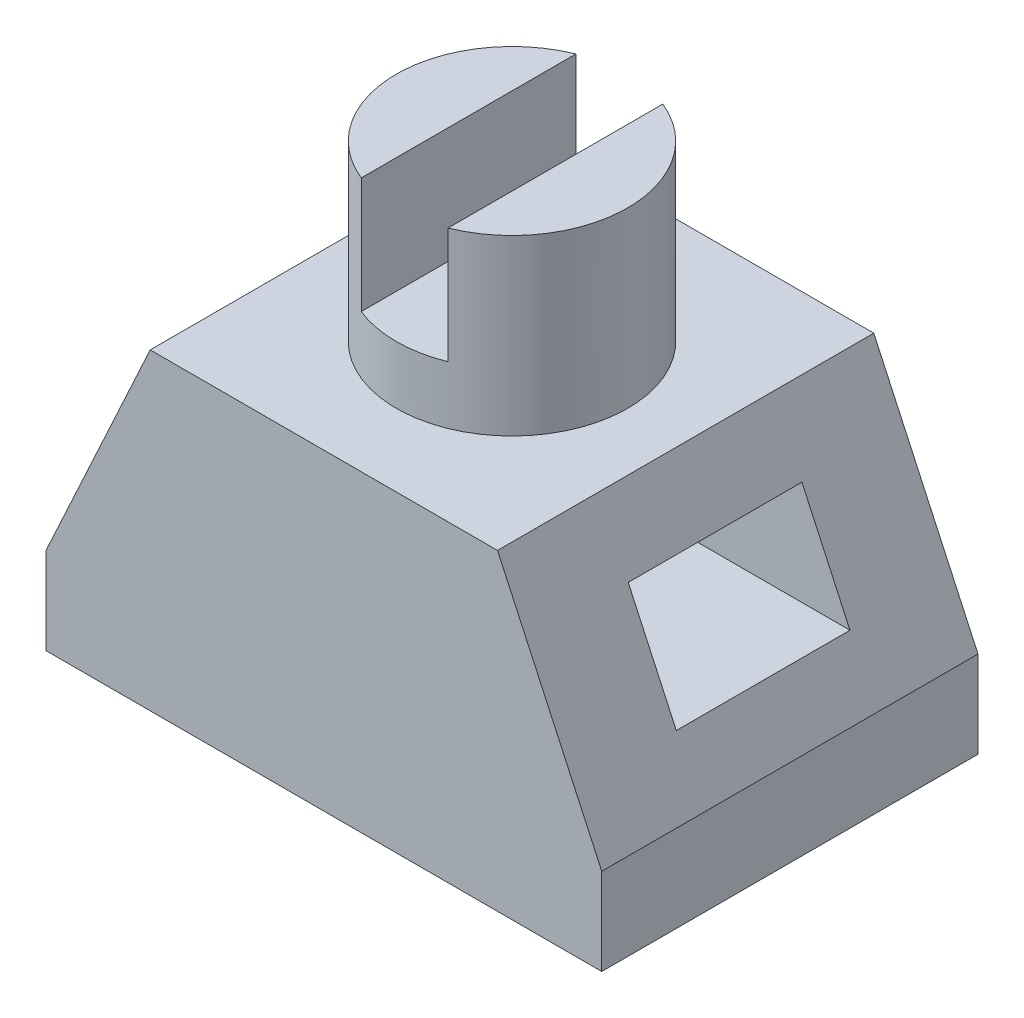
ISO-10303-21;
HEADER;
FILE_DESCRIPTION(('STEP AP214'),'2;1');
FILE_NAME('part.step','',(''),(''),'','','');
FILE_SCHEMA(('AUTOMOTIVE_DESIGN { 1 0 10303 214 1 1 1 1 }'));
ENDSEC;
DATA;
#1=APPLICATION_CONTEXT('core data for automotive mechanical design processes');
#2=APPLICATION_PROTOCOL_DEFINITION('international standard','automotive_design',2000,#1);
#3=PRODUCT_CONTEXT('',#1,'mechanical');
#4=PRODUCT('Part','Part','',(#3));
#5=PRODUCT_RELATED_PRODUCT_CATEGORY('part','',(#4));
#6=PRODUCT_DEFINITION_FORMATION('','',#4);
#7=PRODUCT_DEFINITION_CONTEXT('part definition',#1,'design');
#8=PRODUCT_DEFINITION('design','',#6,#7);
#9=PRODUCT_DEFINITION_SHAPE('','',#8);
#10=(LENGTH_UNIT() NAMED_UNIT(*) SI_UNIT(.MILLI.,.METRE.));
#11=(NAMED_UNIT(*) PLANE_ANGLE_UNIT() SI_UNIT($,.RADIAN.));
#12=(NAMED_UNIT(*) SI_UNIT($,.STERADIAN.) SOLID_ANGLE_UNIT());
#13=UNCERTAINTY_MEASURE_WITH_UNIT(LENGTH_MEASURE(1.E-05),#10,'distance_accuracy_value','');
#14=(GEOMETRIC_REPRESENTATION_CONTEXT(3) GLOBAL_UNCERTAINTY_ASSIGNED_CONTEXT((#13)) GLOBAL_UNIT_ASSIGNED_CONTEXT((#10,
#11,#12)) REPRESENTATION_CONTEXT('',''));
#15=CARTESIAN_POINT('',(0.,0.,0.));
#16=DIRECTION('',(0.,0.,1.));
#17=DIRECTION('',(1.,0.,0.));
#18=AXIS2_PLACEMENT_3D('',#15,#16,#17);
#19=CARTESIAN_POINT('',(0.,57.,0.));
#20=DIRECTION('',(0.,1.,0.));
#21=DIRECTION('',(0.,0.,1.));
#22=AXIS2_PLACEMENT_3D('',#19,#20,#21);
#23=PLANE('',#22);
#24=DIRECTION('',(0.,0.,-1.));
#25=VECTOR('',#24,1.);
#26=CARTESIAN_POINT('',(7.5,57.,0.));
#27=LINE('',#26,#25);
#28=CARTESIAN_POINT('',(7.5,57.,18.5404962177392));
#29=VERTEX_POINT('',#28);
#30=CARTESIAN_POINT('',(7.5,57.,-18.5404962177392));
#31=VERTEX_POINT('',#30);
#32=EDGE_CURVE('E142',#29,#31,#27,.T.);
#33=ORIENTED_EDGE('',*,*,#32,.F.);
#34=CARTESIAN_POINT('',(0.,57.,0.));
#35=DIRECTION('',(0.,1.,0.));
#36=DIRECTION('',(0.,0.,1.));
#37=AXIS2_PLACEMENT_3D('',#34,#35,#36);
#38=CIRCLE('',#37,20.);
#39=EDGE_CURVE('E154',#29,#31,#38,.T.);
#40=ORIENTED_EDGE('',*,*,#39,.T.);
#41=EDGE_LOOP('',(#33,#40));
#42=FACE_BOUND('',#41,.T.);
#43=ADVANCED_FACE('F35',(#42),#23,.T.);
#44=CARTESIAN_POINT('',(30.,27.,32.5));
#45=DIRECTION('',(0.,-1.,0.));
#46=DIRECTION('',(0.,0.,-1.));
#47=AXIS2_PLACEMENT_3D('',#44,#45,#46);
#48=PLANE('',#47);
#49=DIRECTION('',(-1.,0.,0.));
#50=VECTOR('',#49,1.);
#51=CARTESIAN_POINT('',(30.,27.,-32.5));
#52=LINE('',#51,#50);
#53=CARTESIAN_POINT('',(30.,27.,-32.5));
#54=VERTEX_POINT('',#53);
#55=CARTESIAN_POINT('',(-30.,27.,-32.5));
#56=VERTEX_POINT('',#55);
#57=EDGE_CURVE('E208',#54,#56,#52,.T.);
#58=ORIENTED_EDGE('',*,*,#57,.T.);
#59=DIRECTION('',(0.,0.,-1.));
#60=VECTOR('',#59,1.);
#61=CARTESIAN_POINT('',(-30.,27.,32.5));
#62=LINE('',#61,#60);
#63=CARTESIAN_POINT('',(-30.,27.,32.5));
#64=VERTEX_POINT('',#63);
#65=EDGE_CURVE('E213',#64,#56,#62,.T.);
#66=ORIENTED_EDGE('',*,*,#65,.F.);
#67=DIRECTION('',(-1.,0.,0.));
#68=VECTOR('',#67,1.);
#69=CARTESIAN_POINT('',(30.,27.,32.5));
#70=LINE('',#69,#68);
#71=CARTESIAN_POINT('',(30.,27.,32.5));
#72=VERTEX_POINT('',#71);
#73=EDGE_CURVE('E195',#72,#64,#70,.T.);
#74=ORIENTED_EDGE('',*,*,#73,.F.);
#75=DIRECTION('',(0.,0.,-1.));
#76=VECTOR('',#75,1.);
#77=CARTESIAN_POINT('',(30.,27.,32.5));
#78=LINE('',#77,#76);
#79=EDGE_CURVE('E216',#72,#54,#78,.T.);
#80=ORIENTED_EDGE('',*,*,#79,.T.);
#81=EDGE_LOOP('',(#58,#66,#74,#80));
#82=FACE_BOUND('',#81,.T.);
#83=CARTESIAN_POINT('',(0.,27.,0.));
#84=DIRECTION('',(0.,-1.,0.));
#85=DIRECTION('',(0.,0.,-1.));
#86=AXIS2_PLACEMENT_3D('',#83,#84,#85);
#87=CIRCLE('',#86,20.);
#88=CARTESIAN_POINT('',(0.,27.,-20.));
#89=VERTEX_POINT('',#88);
#90=EDGE_CURVE('E143',#89,#89,#87,.F.);
#91=ORIENTED_EDGE('',*,*,#90,.F.);
#92=EDGE_LOOP('',(#91));
#93=FACE_BOUND('',#92,.T.);
#94=ADVANCED_FACE('F256',(#82,#93),#48,.F.);
#95=CARTESIAN_POINT('',(-48.,-12.,32.5));
#96=DIRECTION('',(1.,0.,0.));
#97=DIRECTION('',(0.,0.,-1.));
#98=AXIS2_PLACEMENT_3D('',#95,#96,#97);
#99=PLANE('',#98);
#100=DIRECTION('',(0.,-1.,0.));
#101=VECTOR('',#100,1.);
#102=CARTESIAN_POINT('',(-48.,-12.,-32.5));
#103=LINE('',#102,#101);
#104=CARTESIAN_POINT('',(-48.,-12.,-32.5));
#105=VERTEX_POINT('',#104);
#106=CARTESIAN_POINT('',(-48.,-27.,-32.5));
#107=VERTEX_POINT('',#106);
#108=EDGE_CURVE('E184',#105,#107,#103,.T.);
#109=ORIENTED_EDGE('',*,*,#108,.T.);
#110=DIRECTION('',(0.,0.,-1.));
#111=VECTOR('',#110,1.);
#112=CARTESIAN_POINT('',(-48.,-27.,32.5));
#113=LINE('',#112,#111);
#114=CARTESIAN_POINT('',(-48.,-27.,32.5));
#115=VERTEX_POINT('',#114);
#116=EDGE_CURVE('E225',#115,#107,#113,.T.);
#117=ORIENTED_EDGE('',*,*,#116,.F.);
#118=DIRECTION('',(0.,-1.,0.));
#119=VECTOR('',#118,1.);
#120=CARTESIAN_POINT('',(-48.,-12.,32.5));
#121=LINE('',#120,#119);
#122=CARTESIAN_POINT('',(-48.,-12.,32.5));
#123=VERTEX_POINT('',#122);
#124=EDGE_CURVE('E185',#123,#115,#121,.T.);
#125=ORIENTED_EDGE('',*,*,#124,.F.);
#126=DIRECTION('',(0.,0.,-1.));
#127=VECTOR('',#126,1.);
#128=CARTESIAN_POINT('',(-48.,-12.,32.5));
#129=LINE('',#128,#127);
#130=EDGE_CURVE('E199',#123,#105,#129,.T.);
#131=ORIENTED_EDGE('',*,*,#130,.T.);
#132=EDGE_LOOP('',(#109,#117,#125,#131));
#133=FACE_BOUND('',#132,.T.);
#134=ADVANCED_FACE('F37',(#133),#99,.F.);
#135=CARTESIAN_POINT('',(-48.,-27.,32.5));
#136=DIRECTION('',(0.,1.,0.));
#137=DIRECTION('',(0.,0.,1.));
#138=AXIS2_PLACEMENT_3D('',#135,#136,#137);
#139=PLANE('',#138);
#140=DIRECTION('',(1.,0.,0.));
#141=VECTOR('',#140,1.);
#142=CARTESIAN_POINT('',(-48.,-27.,-32.5));
#143=LINE('',#142,#141);
#144=CARTESIAN_POINT('',(48.,-27.,-32.5));
#145=VERTEX_POINT('',#144);
#146=EDGE_CURVE('E202',#107,#145,#143,.T.);
#147=ORIENTED_EDGE('',*,*,#146,.T.);
#148=DIRECTION('',(0.,0.,-1.));
#149=VECTOR('',#148,1.);
#150=CARTESIAN_POINT('',(48.,-27.,32.5));
#151=LINE('',#150,#149);
#152=CARTESIAN_POINT('',(48.,-27.,32.5));
#153=VERTEX_POINT('',#152);
#154=EDGE_CURVE('E222',#153,#145,#151,.T.);
#155=ORIENTED_EDGE('',*,*,#154,.F.);
#156=DIRECTION('',(1.,0.,0.));
#157=VECTOR('',#156,1.);
#158=CARTESIAN_POINT('',(-48.,-27.,32.5));
#159=LINE('',#158,#157);
#160=EDGE_CURVE('E188',#115,#153,#159,.T.);
#161=ORIENTED_EDGE('',*,*,#160,.F.);
#162=ORIENTED_EDGE('',*,*,#116,.T.);
#163=EDGE_LOOP('',(#147,#155,#161,#162));
#164=FACE_BOUND('',#163,.T.);
#165=ADVANCED_FACE('F307',(#164),#139,.F.);
#166=CARTESIAN_POINT('',(48.,-12.,32.5));
#167=DIRECTION('',(-1.,0.,0.));
#168=DIRECTION('',(0.,0.,1.));
#169=AXIS2_PLACEMENT_3D('',#166,#167,#168);
#170=PLANE('',#169);
#171=DIRECTION('',(0.,1.,0.));
#172=VECTOR('',#171,1.);
#173=CARTESIAN_POINT('',(48.,-12.,-32.5));
#174=LINE('',#173,#172);
#175=CARTESIAN_POINT('',(48.,-12.,-32.5));
#176=VERTEX_POINT('',#175);
#177=EDGE_CURVE('E204',#145,#176,#174,.T.);
#178=ORIENTED_EDGE('',*,*,#177,.T.);
#179=DIRECTION('',(0.,0.,-1.));
#180=VECTOR('',#179,1.);
#181=CARTESIAN_POINT('',(48.,-12.,32.5));
#182=LINE('',#181,#180);
#183=CARTESIAN_POINT('',(48.,-12.,32.5));
#184=VERTEX_POINT('',#183);
#185=EDGE_CURVE('E219',#184,#176,#182,.T.);
#186=ORIENTED_EDGE('',*,*,#185,.F.);
#187=DIRECTION('',(0.,1.,0.));
#188=VECTOR('',#187,1.);
#189=CARTESIAN_POINT('',(48.,-12.,32.5));
#190=LINE('',#189,#188);
#191=EDGE_CURVE('E191',#153,#184,#190,.T.);
#192=ORIENTED_EDGE('',*,*,#191,.F.);
#193=ORIENTED_EDGE('',*,*,#154,.T.);
#194=EDGE_LOOP('',(#178,#186,#192,#193));
#195=FACE_BOUND('',#194,.T.);
#196=ADVANCED_FACE('F304',(#195),#170,.F.);
#197=CARTESIAN_POINT('',(30.,27.,32.5));
#198=DIRECTION('',(-0.907959384500451,-0.419058177461748,0.));
#199=DIRECTION('',(0.419058177461748,-0.907959384500451,0.));
#200=AXIS2_PLACEMENT_3D('',#197,#198,#199);
#201=PLANE('',#200);
#202=DIRECTION('',(0.,0.,-1.));
#203=VECTOR('',#202,1.);
#204=CARTESIAN_POINT('',(35.0769230769231,16.,32.5));
#205=LINE('',#204,#203);
#206=CARTESIAN_POINT('',(35.0769230769231,16.,15.));
#207=VERTEX_POINT('',#206);
#208=CARTESIAN_POINT('',(35.0769230769231,16.,-15.));
#209=VERTEX_POINT('',#208);
#210=EDGE_CURVE('E165',#207,#209,#205,.T.);
#211=ORIENTED_EDGE('',*,*,#210,.T.);
#212=DIRECTION('',(0.419058177461748,-0.907959384500451,0.));
#213=VECTOR('',#212,1.);
#214=CARTESIAN_POINT('',(30.,27.,-15.));
#215=LINE('',#214,#213);
#216=CARTESIAN_POINT('',(43.3846153846154,-2.,-15.));
#217=VERTEX_POINT('',#216);
#218=EDGE_CURVE('E181',#209,#217,#215,.T.);
#219=ORIENTED_EDGE('',*,*,#218,.T.);
#220=DIRECTION('',(0.,0.,1.));
#221=VECTOR('',#220,1.);
#222=CARTESIAN_POINT('',(43.3846153846154,-2.,32.5));
#223=LINE('',#222,#221);
#224=CARTESIAN_POINT('',(43.3846153846154,-2.,15.));
#225=VERTEX_POINT('',#224);
#226=EDGE_CURVE('E178',#217,#225,#223,.T.);
#227=ORIENTED_EDGE('',*,*,#226,.T.);
#228=DIRECTION('',(-0.419058177461748,0.907959384500451,0.));
#229=VECTOR('',#228,1.);
#230=CARTESIAN_POINT('',(30.,27.,15.));
#231=LINE('',#230,#229);
#232=EDGE_CURVE('E175',#225,#207,#231,.T.);
#233=ORIENTED_EDGE('',*,*,#232,.T.);
#234=EDGE_LOOP('',(#211,#219,#227,#233));
#235=FACE_BOUND('',#234,.T.);
#236=DIRECTION('',(-0.419058177461748,0.907959384500451,0.));
#237=VECTOR('',#236,1.);
#238=CARTESIAN_POINT('',(30.,27.,-32.5));
#239=LINE('',#238,#237);
#240=EDGE_CURVE('E206',#176,#54,#239,.T.);
#241=ORIENTED_EDGE('',*,*,#240,.T.);
#242=ORIENTED_EDGE('',*,*,#79,.F.);
#243=DIRECTION('',(-0.419058177461748,0.907959384500451,0.));
#244=VECTOR('',#243,1.);
#245=CARTESIAN_POINT('',(30.,27.,32.5));
#246=LINE('',#245,#244);
#247=EDGE_CURVE('E193',#184,#72,#246,.T.);
#248=ORIENTED_EDGE('',*,*,#247,.F.);
#249=ORIENTED_EDGE('',*,*,#185,.T.);
#250=EDGE_LOOP('',(#241,#242,#248,#249));
#251=FACE_BOUND('',#250,.T.);
#252=ADVANCED_FACE('F299',(#235,#251),#201,.F.);
#253=CARTESIAN_POINT('',(-30.,27.,32.5));
#254=DIRECTION('',(0.907959384500452,-0.419058177461746,0.));
#255=DIRECTION('',(0.419058177461746,0.907959384500452,0.));
#256=AXIS2_PLACEMENT_3D('',#253,#254,#255);
#257=PLANE('',#256);
#258=DIRECTION('',(0.,0.,-1.));
#259=VECTOR('',#258,1.);
#260=CARTESIAN_POINT('',(-43.3846153846154,-2.,32.5));
#261=LINE('',#260,#259);
#262=CARTESIAN_POINT('',(-43.3846153846154,-2.00000000000001,15.));
#263=VERTEX_POINT('',#262);
#264=CARTESIAN_POINT('',(-43.3846153846154,-2.,-15.));
#265=VERTEX_POINT('',#264);
#266=EDGE_CURVE('E234',#263,#265,#261,.T.);
#267=ORIENTED_EDGE('',*,*,#266,.T.);
#268=DIRECTION('',(0.419058177461746,0.907959384500452,0.));
#269=VECTOR('',#268,1.);
#270=CARTESIAN_POINT('',(-30.,27.,-15.));
#271=LINE('',#270,#269);
#272=CARTESIAN_POINT('',(-35.0769230769231,16.,-15.));
#273=VERTEX_POINT('',#272);
#274=EDGE_CURVE('E237',#265,#273,#271,.T.);
#275=ORIENTED_EDGE('',*,*,#274,.T.);
#276=DIRECTION('',(0.,0.,1.));
#277=VECTOR('',#276,1.);
#278=CARTESIAN_POINT('',(-35.0769230769231,16.,32.5));
#279=LINE('',#278,#277);
#280=CARTESIAN_POINT('',(-35.0769230769231,16.,15.));
#281=VERTEX_POINT('',#280);
#282=EDGE_CURVE('E228',#273,#281,#279,.T.);
#283=ORIENTED_EDGE('',*,*,#282,.T.);
#284=DIRECTION('',(-0.419058177461746,-0.907959384500452,0.));
#285=VECTOR('',#284,1.);
#286=CARTESIAN_POINT('',(-30.,27.,15.));
#287=LINE('',#286,#285);
#288=EDGE_CURVE('E231',#281,#263,#287,.T.);
#289=ORIENTED_EDGE('',*,*,#288,.T.);
#290=EDGE_LOOP('',(#267,#275,#283,#289));
#291=FACE_BOUND('',#290,.T.);
#292=DIRECTION('',(-0.419058177461746,-0.907959384500452,0.));
#293=VECTOR('',#292,1.);
#294=CARTESIAN_POINT('',(-30.,27.,-32.5));
#295=LINE('',#294,#293);
#296=EDGE_CURVE('E189',#56,#105,#295,.T.);
#297=ORIENTED_EDGE('',*,*,#296,.T.);
#298=ORIENTED_EDGE('',*,*,#130,.F.);
#299=DIRECTION('',(-0.419058177461746,-0.907959384500452,0.));
#300=VECTOR('',#299,1.);
#301=CARTESIAN_POINT('',(-30.,27.,32.5));
#302=LINE('',#301,#300);
#303=EDGE_CURVE('E197',#64,#123,#302,.T.);
#304=ORIENTED_EDGE('',*,*,#303,.F.);
#305=ORIENTED_EDGE('',*,*,#65,.T.);
#306=EDGE_LOOP('',(#297,#298,#304,#305));
#307=FACE_BOUND('',#306,.T.);
#308=ADVANCED_FACE('F293',(#291,#307),#257,.F.);
#309=CARTESIAN_POINT('',(0.,0.,32.5));
#310=DIRECTION('',(0.,0.,1.));
#311=DIRECTION('',(1.,0.,0.));
#312=AXIS2_PLACEMENT_3D('',#309,#310,#311);
#313=PLANE('',#312);
#314=ORIENTED_EDGE('',*,*,#124,.T.);
#315=ORIENTED_EDGE('',*,*,#160,.T.);
#316=ORIENTED_EDGE('',*,*,#191,.T.);
#317=ORIENTED_EDGE('',*,*,#247,.T.);
#318=ORIENTED_EDGE('',*,*,#73,.T.);
#319=ORIENTED_EDGE('',*,*,#303,.T.);
#320=EDGE_LOOP('',(#314,#315,#316,#317,#318,#319));
#321=FACE_BOUND('',#320,.T.);
#322=ADVANCED_FACE('F290',(#321),#313,.T.);
#323=CARTESIAN_POINT('',(0.,0.,-32.5));
#324=DIRECTION('',(0.,0.,1.));
#325=DIRECTION('',(1.,0.,0.));
#326=AXIS2_PLACEMENT_3D('',#323,#324,#325);
#327=PLANE('',#326);
#328=ORIENTED_EDGE('',*,*,#108,.F.);
#329=ORIENTED_EDGE('',*,*,#296,.F.);
#330=ORIENTED_EDGE('',*,*,#57,.F.);
#331=ORIENTED_EDGE('',*,*,#240,.F.);
#332=ORIENTED_EDGE('',*,*,#177,.F.);
#333=ORIENTED_EDGE('',*,*,#146,.F.);
#334=EDGE_LOOP('',(#328,#329,#330,#331,#332,#333));
#335=FACE_BOUND('',#334,.T.);
#336=ADVANCED_FACE('F288',(#335),#327,.F.);
#337=CARTESIAN_POINT('',(-48.,-2.,-15.));
#338=DIRECTION('',(0.,0.,-1.));
#339=DIRECTION('',(-1.,0.,0.));
#340=AXIS2_PLACEMENT_3D('',#337,#338,#339);
#341=PLANE('',#340);
#342=DIRECTION('',(1.,0.,0.));
#343=VECTOR('',#342,1.);
#344=CARTESIAN_POINT('',(-48.,16.,-15.));
#345=LINE('',#344,#343);
#346=EDGE_CURVE('E58',#273,#209,#345,.T.);
#347=ORIENTED_EDGE('',*,*,#346,.F.);
#348=ORIENTED_EDGE('',*,*,#274,.F.);
#349=DIRECTION('',(1.,0.,0.));
#350=VECTOR('',#349,1.);
#351=CARTESIAN_POINT('',(-48.,-2.,-15.));
#352=LINE('',#351,#350);
#353=EDGE_CURVE('E162',#265,#217,#352,.T.);
#354=ORIENTED_EDGE('',*,*,#353,.T.);
#355=ORIENTED_EDGE('',*,*,#218,.F.);
#356=EDGE_LOOP('',(#347,#348,#354,#355));
#357=FACE_BOUND('',#356,.T.);
#358=ADVANCED_FACE('F281',(#357),#341,.F.);
#359=CARTESIAN_POINT('',(-48.,-2.,15.));
#360=DIRECTION('',(0.,-1.,0.));
#361=DIRECTION('',(0.,0.,-1.));
#362=AXIS2_PLACEMENT_3D('',#359,#360,#361);
#363=PLANE('',#362);
#364=ORIENTED_EDGE('',*,*,#353,.F.);
#365=ORIENTED_EDGE('',*,*,#266,.F.);
#366=DIRECTION('',(1.,0.,0.));
#367=VECTOR('',#366,1.);
#368=CARTESIAN_POINT('',(-48.,-2.,15.));
#369=LINE('',#368,#367);
#370=EDGE_CURVE('E166',#263,#225,#369,.T.);
#371=ORIENTED_EDGE('',*,*,#370,.T.);
#372=ORIENTED_EDGE('',*,*,#226,.F.);
#373=EDGE_LOOP('',(#364,#365,#371,#372));
#374=FACE_BOUND('',#373,.T.);
#375=ADVANCED_FACE('F278',(#374),#363,.F.);
#376=CARTESIAN_POINT('',(-48.,-2.,15.));
#377=DIRECTION('',(0.,0.,1.));
#378=DIRECTION('',(1.,0.,0.));
#379=AXIS2_PLACEMENT_3D('',#376,#377,#378);
#380=PLANE('',#379);
#381=ORIENTED_EDGE('',*,*,#370,.F.);
#382=ORIENTED_EDGE('',*,*,#288,.F.);
#383=DIRECTION('',(1.,0.,0.));
#384=VECTOR('',#383,1.);
#385=CARTESIAN_POINT('',(-48.,16.,15.));
#386=LINE('',#385,#384);
#387=EDGE_CURVE('E169',#281,#207,#386,.T.);
#388=ORIENTED_EDGE('',*,*,#387,.T.);
#389=ORIENTED_EDGE('',*,*,#232,.F.);
#390=EDGE_LOOP('',(#381,#382,#388,#389));
#391=FACE_BOUND('',#390,.T.);
#392=ADVANCED_FACE('F275',(#391),#380,.F.);
#393=CARTESIAN_POINT('',(-48.,16.,15.));
#394=DIRECTION('',(0.,1.,0.));
#395=DIRECTION('',(0.,0.,1.));
#396=AXIS2_PLACEMENT_3D('',#393,#394,#395);
#397=PLANE('',#396);
#398=ORIENTED_EDGE('',*,*,#387,.F.);
#399=ORIENTED_EDGE('',*,*,#282,.F.);
#400=ORIENTED_EDGE('',*,*,#346,.T.);
#401=ORIENTED_EDGE('',*,*,#210,.F.);
#402=EDGE_LOOP('',(#398,#399,#400,#401));
#403=FACE_BOUND('',#402,.T.);
#404=ADVANCED_FACE('F271',(#403),#397,.F.);
#405=CARTESIAN_POINT('',(0.,57.,0.));
#406=DIRECTION('',(0.,-1.,0.));
#407=DIRECTION('',(0.,0.,-1.));
#408=AXIS2_PLACEMENT_3D('',#405,#406,#407);
#409=CYLINDRICAL_SURFACE('',#408,20.);
#410=ORIENTED_EDGE('',*,*,#39,.F.);
#411=DIRECTION('',(0.,-1.,0.));
#412=VECTOR('',#411,1.);
#413=CARTESIAN_POINT('',(7.5,57.,18.5404962177392));
#414=LINE('',#413,#412);
#415=CARTESIAN_POINT('',(7.5,37.,18.5404962177392));
#416=VERTEX_POINT('',#415);
#417=EDGE_CURVE('E155',#29,#416,#414,.T.);
#418=ORIENTED_EDGE('',*,*,#417,.T.);
#419=CARTESIAN_POINT('',(0.,37.,0.));
#420=DIRECTION('',(0.,-1.,0.));
#421=DIRECTION('',(0.,0.,-1.));
#422=AXIS2_PLACEMENT_3D('',#419,#420,#421);
#423=CIRCLE('',#422,20.);
#424=CARTESIAN_POINT('',(-7.5,37.,18.5404962177392));
#425=VERTEX_POINT('',#424);
#426=EDGE_CURVE('E11',#416,#425,#423,.T.);
#427=ORIENTED_EDGE('',*,*,#426,.T.);
#428=DIRECTION('',(0.,-1.,0.));
#429=VECTOR('',#428,1.);
#430=CARTESIAN_POINT('',(-7.5,57.,18.5404962177392));
#431=LINE('',#430,#429);
#432=CARTESIAN_POINT('',(-7.5,57.,18.5404962177392));
#433=VERTEX_POINT('',#432);
#434=EDGE_CURVE('E137',#425,#433,#431,.F.);
#435=ORIENTED_EDGE('',*,*,#434,.T.);
#436=CARTESIAN_POINT('',(-7.5,57.,-18.5404962177392));
#437=VERTEX_POINT('',#436);
#438=EDGE_CURVE('E149',#437,#433,#38,.T.);
#439=ORIENTED_EDGE('',*,*,#438,.F.);
#440=DIRECTION('',(0.,-1.,0.));
#441=VECTOR('',#440,1.);
#442=CARTESIAN_POINT('',(-7.5,57.,-18.5404962177392));
#443=LINE('',#442,#441);
#444=CARTESIAN_POINT('',(-7.5,37.,-18.5404962177392));
#445=VERTEX_POINT('',#444);
#446=EDGE_CURVE('E50',#437,#445,#443,.T.);
#447=ORIENTED_EDGE('',*,*,#446,.T.);
#448=CARTESIAN_POINT('',(7.5,37.,-18.5404962177392));
#449=VERTEX_POINT('',#448);
#450=EDGE_CURVE('E39',#445,#449,#423,.T.);
#451=ORIENTED_EDGE('',*,*,#450,.T.);
#452=DIRECTION('',(0.,-1.,0.));
#453=VECTOR('',#452,1.);
#454=CARTESIAN_POINT('',(7.5,57.,-18.5404962177392));
#455=LINE('',#454,#453);
#456=EDGE_CURVE('E158',#449,#31,#455,.F.);
#457=ORIENTED_EDGE('',*,*,#456,.T.);
#458=EDGE_LOOP('',(#410,#418,#427,#435,#439,#447,#451,#457));
#459=FACE_BOUND('',#458,.T.);
#460=ORIENTED_EDGE('',*,*,#90,.T.);
#461=EDGE_LOOP('',(#460));
#462=FACE_BOUND('',#461,.T.);
#463=ADVANCED_FACE('F147',(#459,#462),#409,.T.);
#464=DIRECTION('',(0.,0.,1.));
#465=VECTOR('',#464,1.);
#466=CARTESIAN_POINT('',(-7.5,57.,0.));
#467=LINE('',#466,#465);
#468=EDGE_CURVE('E134',#437,#433,#467,.T.);
#469=ORIENTED_EDGE('',*,*,#468,.F.);
#470=ORIENTED_EDGE('',*,*,#438,.T.);
#471=EDGE_LOOP('',(#469,#470));
#472=FACE_BOUND('',#471,.T.);
#473=ADVANCED_FACE('F153',(#472),#23,.T.);
#474=CARTESIAN_POINT('',(0.,37.,0.));
#475=DIRECTION('',(0.,-1.,0.));
#476=DIRECTION('',(0.,0.,-1.));
#477=AXIS2_PLACEMENT_3D('',#474,#475,#476);
#478=PLANE('',#477);
#479=DIRECTION('',(0.,0.,-1.));
#480=VECTOR('',#479,1.);
#481=CARTESIAN_POINT('',(7.5,37.,32.5));
#482=LINE('',#481,#480);
#483=EDGE_CURVE('E249',#416,#449,#482,.T.);
#484=ORIENTED_EDGE('',*,*,#483,.T.);
#485=ORIENTED_EDGE('',*,*,#450,.F.);
#486=DIRECTION('',(0.,0.,1.));
#487=VECTOR('',#486,1.);
#488=CARTESIAN_POINT('',(-7.5,37.,32.5));
#489=LINE('',#488,#487);
#490=EDGE_CURVE('E151',#445,#425,#489,.T.);
#491=ORIENTED_EDGE('',*,*,#490,.T.);
#492=ORIENTED_EDGE('',*,*,#426,.F.);
#493=EDGE_LOOP('',(#484,#485,#491,#492));
#494=FACE_BOUND('',#493,.T.);
#495=ADVANCED_FACE('F247',(#494),#478,.F.);
#496=CARTESIAN_POINT('',(7.5,37.,32.5));
#497=DIRECTION('',(1.,0.,0.));
#498=DIRECTION('',(0.,0.,-1.));
#499=AXIS2_PLACEMENT_3D('',#496,#497,#498);
#500=PLANE('',#499);
#501=ORIENTED_EDGE('',*,*,#32,.T.);
#502=ORIENTED_EDGE('',*,*,#456,.F.);
#503=ORIENTED_EDGE('',*,*,#483,.F.);
#504=ORIENTED_EDGE('',*,*,#417,.F.);
#505=EDGE_LOOP('',(#501,#502,#503,#504));
#506=FACE_BOUND('',#505,.T.);
#507=ADVANCED_FACE('F253',(#506),#500,.F.);
#508=CARTESIAN_POINT('',(-7.5,37.,32.5));
#509=DIRECTION('',(-1.,0.,0.));
#510=DIRECTION('',(0.,0.,1.));
#511=AXIS2_PLACEMENT_3D('',#508,#509,#510);
#512=PLANE('',#511);
#513=ORIENTED_EDGE('',*,*,#468,.T.);
#514=ORIENTED_EDGE('',*,*,#434,.F.);
#515=ORIENTED_EDGE('',*,*,#490,.F.);
#516=ORIENTED_EDGE('',*,*,#446,.F.);
#517=EDGE_LOOP('',(#513,#514,#515,#516));
#518=FACE_BOUND('',#517,.T.);
#519=ADVANCED_FACE('F136',(#518),#512,.F.);
#520=CLOSED_SHELL('',(#43,#94,#134,#165,#196,#252,#308,#322,#336,#358,#375,#392,#404,#463,#473,
#495,#507,#519));
#521=MANIFOLD_SOLID_BREP('B2',#520);
#522=ADVANCED_BREP_SHAPE_REPRESENTATION('',(#18,#521),#14);
#523=SHAPE_DEFINITION_REPRESENTATION(#9,#522);
ENDSEC;
END-ISO-10303-21;
